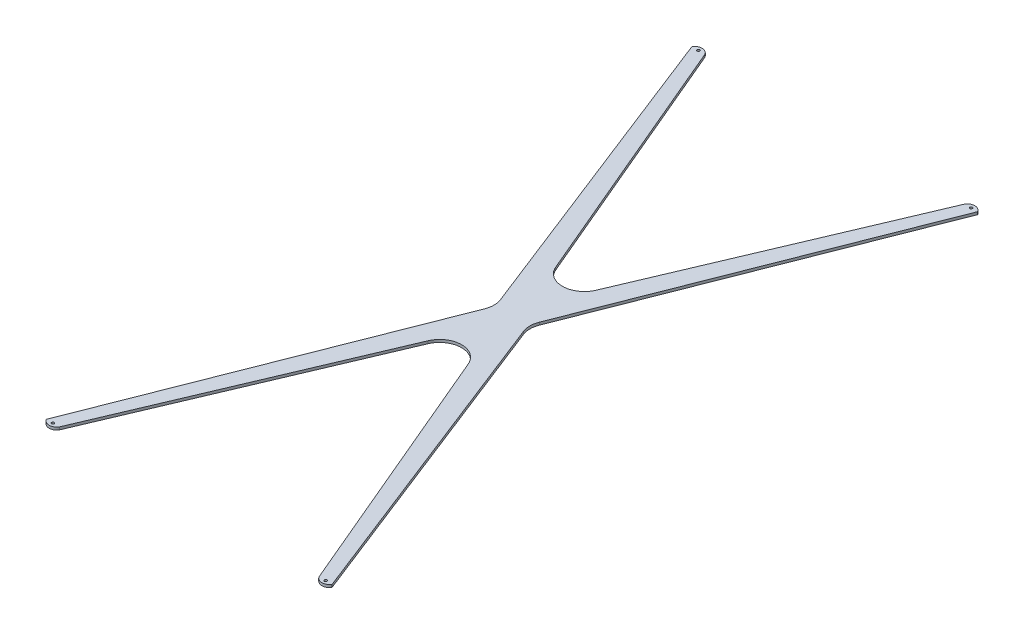
ISO-10303-21;
HEADER;
FILE_DESCRIPTION(('STEP AP214'),'2;1');
FILE_NAME('part.step','',(''),(''),'','','');
FILE_SCHEMA(('AUTOMOTIVE_DESIGN { 1 0 10303 214 1 1 1 1 }'));
ENDSEC;
DATA;
#1=APPLICATION_CONTEXT('core data for automotive mechanical design processes');
#2=APPLICATION_PROTOCOL_DEFINITION('international standard','automotive_design',2000,#1);
#3=PRODUCT_CONTEXT('',#1,'mechanical');
#4=PRODUCT('Part','Part','',(#3));
#5=PRODUCT_RELATED_PRODUCT_CATEGORY('part','',(#4));
#6=PRODUCT_DEFINITION_FORMATION('','',#4);
#7=PRODUCT_DEFINITION_CONTEXT('part definition',#1,'design');
#8=PRODUCT_DEFINITION('design','',#6,#7);
#9=PRODUCT_DEFINITION_SHAPE('','',#8);
#10=(LENGTH_UNIT() NAMED_UNIT(*) SI_UNIT(.MILLI.,.METRE.));
#11=(NAMED_UNIT(*) PLANE_ANGLE_UNIT() SI_UNIT($,.RADIAN.));
#12=(NAMED_UNIT(*) SI_UNIT($,.STERADIAN.) SOLID_ANGLE_UNIT());
#13=UNCERTAINTY_MEASURE_WITH_UNIT(LENGTH_MEASURE(1.E-05),#10,'distance_accuracy_value','');
#14=(GEOMETRIC_REPRESENTATION_CONTEXT(3) GLOBAL_UNCERTAINTY_ASSIGNED_CONTEXT((#13)) GLOBAL_UNIT_ASSIGNED_CONTEXT((#10,
#11,#12)) REPRESENTATION_CONTEXT('',''));
#15=CARTESIAN_POINT('',(0.,0.,0.));
#16=DIRECTION('',(0.,0.,1.));
#17=DIRECTION('',(1.,0.,0.));
#18=AXIS2_PLACEMENT_3D('',#15,#16,#17);
#19=CARTESIAN_POINT('',(0.,12.,-2941.02941176471));
#20=DIRECTION('',(0.,-1.,0.));
#21=DIRECTION('',(0.,0.,-1.));
#22=AXIS2_PLACEMENT_3D('',#19,#20,#21);
#23=PLANE('',#22);
#24=CARTESIAN_POINT('',(0.,12.,-2941.02941176471));
#25=DIRECTION('',(0.,1.,0.));
#26=DIRECTION('',(0.,0.,-1.));
#27=AXIS2_PLACEMENT_3D('',#24,#25,#26);
#28=CIRCLE('',#27,34.9705882352942);
#29=CARTESIAN_POINT('',(30.,12.,-2959.));
#30=VERTEX_POINT('',#29);
#31=CARTESIAN_POINT('',(-30.,12.,-2959.));
#32=VERTEX_POINT('',#31);
#33=EDGE_CURVE('E158',#30,#32,#28,.T.);
#34=ORIENTED_EDGE('',*,*,#33,.T.);
#35=DIRECTION('',(0.364980584988872,0.,0.93101513015696));
#36=VECTOR('',#35,1.);
#37=CARTESIAN_POINT('',(550.,12.,-1479.5));
#38=LINE('',#37,#36);
#39=CARTESIAN_POINT('',(535.691872977794,12.,-1515.99805849889));
#40=VERTEX_POINT('',#39);
#41=EDGE_CURVE('E146',#32,#40,#38,.T.);
#42=ORIENTED_EDGE('',*,*,#41,.T.);
#43=CARTESIAN_POINT('',(442.590359962098,12.,-1479.5));
#44=DIRECTION('',(0.,-1.,0.));
#45=DIRECTION('',(0.,0.,-1.));
#46=AXIS2_PLACEMENT_3D('',#43,#44,#45);
#47=CIRCLE('',#46,100.);
#48=CARTESIAN_POINT('',(535.691872977794,12.,-1443.00194150111));
#49=VERTEX_POINT('',#48);
#50=EDGE_CURVE('E199',#40,#49,#47,.T.);
#51=ORIENTED_EDGE('',*,*,#50,.T.);
#52=DIRECTION('',(-0.364980584988872,0.,0.93101513015696));
#53=VECTOR('',#52,1.);
#54=CARTESIAN_POINT('',(550.,12.,-1479.5));
#55=LINE('',#54,#53);
#56=CARTESIAN_POINT('',(-30.,12.,0.));
#57=VERTEX_POINT('',#56);
#58=EDGE_CURVE('E157',#49,#57,#55,.T.);
#59=ORIENTED_EDGE('',*,*,#58,.T.);
#60=CARTESIAN_POINT('',(0.,12.,-17.9705882352943));
#61=DIRECTION('',(0.,1.,0.));
#62=DIRECTION('',(0.,0.,1.));
#63=AXIS2_PLACEMENT_3D('',#60,#61,#62);
#64=CIRCLE('',#63,34.9705882352942);
#65=CARTESIAN_POINT('',(30.,12.,0.));
#66=VERTEX_POINT('',#65);
#67=EDGE_CURVE('E292',#57,#66,#64,.T.);
#68=ORIENTED_EDGE('',*,*,#67,.T.);
#69=DIRECTION('',(0.390078380257152,0.,-0.920781655581798));
#70=VECTOR('',#69,1.);
#71=CARTESIAN_POINT('',(30.,12.,0.));
#72=LINE('',#71,#70);
#73=CARTESIAN_POINT('',(532.92183444182,12.,-1187.14910331687));
#74=VERTEX_POINT('',#73);
#75=EDGE_CURVE('E266',#66,#74,#72,.T.);
#76=ORIENTED_EDGE('',*,*,#75,.T.);
#77=CARTESIAN_POINT('',(625.,12.,-1148.14126529115));
#78=DIRECTION('',(0.,-1.,0.));
#79=DIRECTION('',(0.,0.,-1.));
#80=AXIS2_PLACEMENT_3D('',#77,#78,#79);
#81=CIRCLE('',#80,100.);
#82=CARTESIAN_POINT('',(717.07816555818,12.,-1187.14910331687));
#83=VERTEX_POINT('',#82);
#84=EDGE_CURVE('E11',#74,#83,#81,.T.);
#85=ORIENTED_EDGE('',*,*,#84,.T.);
#86=DIRECTION('',(0.390078380257152,0.,0.920781655581798));
#87=VECTOR('',#86,1.);
#88=CARTESIAN_POINT('',(625.,12.,-1404.5));
#89=LINE('',#88,#87);
#90=CARTESIAN_POINT('',(1220.,12.,0.));
#91=VERTEX_POINT('',#90);
#92=EDGE_CURVE('E289',#83,#91,#89,.T.);
#93=ORIENTED_EDGE('',*,*,#92,.T.);
#94=CARTESIAN_POINT('',(1250.,12.,-17.9705882352938));
#95=DIRECTION('',(0.,1.,0.));
#96=DIRECTION('',(0.,0.,-1.));
#97=AXIS2_PLACEMENT_3D('',#94,#95,#96);
#98=CIRCLE('',#97,34.970588235294);
#99=CARTESIAN_POINT('',(1280.,12.,-4.57966997657877E-13));
#100=VERTEX_POINT('',#99);
#101=EDGE_CURVE('E287',#91,#100,#98,.T.);
#102=ORIENTED_EDGE('',*,*,#101,.T.);
#103=DIRECTION('',(-0.364980584988872,0.,-0.93101513015696));
#104=VECTOR('',#103,1.);
#105=CARTESIAN_POINT('',(1280.,12.,0.));
#106=LINE('',#105,#104);
#107=CARTESIAN_POINT('',(714.308127022207,12.,-1443.00194150111));
#108=VERTEX_POINT('',#107);
#109=EDGE_CURVE('E214',#100,#108,#106,.T.);
#110=ORIENTED_EDGE('',*,*,#109,.T.);
#111=CARTESIAN_POINT('',(807.409640037902,12.,-1479.5));
#112=DIRECTION('',(0.,-1.,0.));
#113=DIRECTION('',(0.,0.,-1.));
#114=AXIS2_PLACEMENT_3D('',#111,#112,#113);
#115=CIRCLE('',#114,100.);
#116=CARTESIAN_POINT('',(714.308127022206,12.,-1515.99805849889));
#117=VERTEX_POINT('',#116);
#118=EDGE_CURVE('E207',#108,#117,#115,.T.);
#119=ORIENTED_EDGE('',*,*,#118,.T.);
#120=DIRECTION('',(0.364980584988872,0.,-0.93101513015696));
#121=VECTOR('',#120,1.);
#122=CARTESIAN_POINT('',(700.,12.,-1479.5));
#123=LINE('',#122,#121);
#124=CARTESIAN_POINT('',(1280.,12.,-2959.));
#125=VERTEX_POINT('',#124);
#126=EDGE_CURVE('E211',#117,#125,#123,.T.);
#127=ORIENTED_EDGE('',*,*,#126,.T.);
#128=CARTESIAN_POINT('',(1250.,12.,-2941.02941176471));
#129=DIRECTION('',(0.,1.,0.));
#130=DIRECTION('',(0.,0.,1.));
#131=AXIS2_PLACEMENT_3D('',#128,#129,#130);
#132=CIRCLE('',#131,34.9705882352942);
#133=CARTESIAN_POINT('',(1220.,12.,-2959.));
#134=VERTEX_POINT('',#133);
#135=EDGE_CURVE('E224',#125,#134,#132,.T.);
#136=ORIENTED_EDGE('',*,*,#135,.T.);
#137=DIRECTION('',(-0.390078380257152,0.,0.920781655581798));
#138=VECTOR('',#137,1.);
#139=CARTESIAN_POINT('',(625.,12.,-1554.5));
#140=LINE('',#139,#138);
#141=CARTESIAN_POINT('',(717.07816555818,12.,-1771.85089668313));
#142=VERTEX_POINT('',#141);
#143=EDGE_CURVE('E282',#134,#142,#140,.T.);
#144=ORIENTED_EDGE('',*,*,#143,.T.);
#145=CARTESIAN_POINT('',(625.,12.,-1810.85873470885));
#146=DIRECTION('',(0.,-1.,0.));
#147=DIRECTION('',(0.,0.,-1.));
#148=AXIS2_PLACEMENT_3D('',#145,#146,#147);
#149=CIRCLE('',#148,100.);
#150=CARTESIAN_POINT('',(532.92183444182,12.,-1771.85089668313));
#151=VERTEX_POINT('',#150);
#152=EDGE_CURVE('E203',#142,#151,#149,.T.);
#153=ORIENTED_EDGE('',*,*,#152,.T.);
#154=DIRECTION('',(-0.390078380257152,0.,-0.920781655581798));
#155=VECTOR('',#154,1.);
#156=CARTESIAN_POINT('',(30.,12.,-2959.));
#157=LINE('',#156,#155);
#158=EDGE_CURVE('E163',#151,#30,#157,.T.);
#159=ORIENTED_EDGE('',*,*,#158,.T.);
#160=EDGE_LOOP('',(#34,#42,#51,#59,#68,#76,#85,#93,#102,#110,#119,#127,#136,#144,#153,#159));
#161=FACE_BOUND('',#160,.T.);
#162=CARTESIAN_POINT('',(1250.,12.,-2959.));
#163=DIRECTION('',(0.,1.,0.));
#164=DIRECTION('',(0.,0.,1.));
#165=AXIS2_PLACEMENT_3D('',#162,#163,#164);
#166=CIRCLE('',#165,6.0000000000001);
#167=CARTESIAN_POINT('',(1250.,12.,-2953.));
#168=VERTEX_POINT('',#167);
#169=EDGE_CURVE('E280',#168,#168,#166,.T.);
#170=ORIENTED_EDGE('',*,*,#169,.F.);
#171=EDGE_LOOP('',(#170));
#172=FACE_BOUND('',#171,.T.);
#173=CARTESIAN_POINT('',(0.,12.,-2959.));
#174=DIRECTION('',(0.,1.,0.));
#175=DIRECTION('',(0.,0.,1.));
#176=AXIS2_PLACEMENT_3D('',#173,#174,#175);
#177=CIRCLE('',#176,6.00000000000001);
#178=CARTESIAN_POINT('',(0.,12.,-2953.));
#179=VERTEX_POINT('',#178);
#180=EDGE_CURVE('E298',#179,#179,#177,.T.);
#181=ORIENTED_EDGE('',*,*,#180,.F.);
#182=EDGE_LOOP('',(#181));
#183=FACE_BOUND('',#182,.T.);
#184=CARTESIAN_POINT('',(1250.,12.,0.));
#185=DIRECTION('',(0.,1.,0.));
#186=DIRECTION('',(0.,0.,1.));
#187=AXIS2_PLACEMENT_3D('',#184,#185,#186);
#188=CIRCLE('',#187,6.0000000000001);
#189=CARTESIAN_POINT('',(1250.,12.,6.0000000000001));
#190=VERTEX_POINT('',#189);
#191=EDGE_CURVE('E304',#190,#190,#188,.T.);
#192=ORIENTED_EDGE('',*,*,#191,.F.);
#193=EDGE_LOOP('',(#192));
#194=FACE_BOUND('',#193,.T.);
#195=CARTESIAN_POINT('',(0.,12.,0.));
#196=DIRECTION('',(0.,1.,0.));
#197=DIRECTION('',(0.,0.,1.));
#198=AXIS2_PLACEMENT_3D('',#195,#196,#197);
#199=CIRCLE('',#198,6.);
#200=CARTESIAN_POINT('',(0.,12.,6.));
#201=VERTEX_POINT('',#200);
#202=EDGE_CURVE('E310',#201,#201,#199,.T.);
#203=ORIENTED_EDGE('',*,*,#202,.F.);
#204=EDGE_LOOP('',(#203));
#205=FACE_BOUND('',#204,.T.);
#206=ADVANCED_FACE('F33',(#161,#172,#183,#194,#205),#23,.F.);
#207=CARTESIAN_POINT('',(0.,0.,-2941.02941176471));
#208=DIRECTION('',(0.,-1.,0.));
#209=DIRECTION('',(0.,0.,-1.));
#210=AXIS2_PLACEMENT_3D('',#207,#208,#209);
#211=PLANE('',#210);
#212=CARTESIAN_POINT('',(1250.,0.,0.));
#213=DIRECTION('',(0.,1.,0.));
#214=DIRECTION('',(0.,0.,1.));
#215=AXIS2_PLACEMENT_3D('',#212,#213,#214);
#216=CIRCLE('',#215,6.0000000000001);
#217=CARTESIAN_POINT('',(1250.,0.,6.0000000000001));
#218=VERTEX_POINT('',#217);
#219=EDGE_CURVE('E307',#218,#218,#216,.T.);
#220=ORIENTED_EDGE('',*,*,#219,.T.);
#221=EDGE_LOOP('',(#220));
#222=FACE_BOUND('',#221,.T.);
#223=CARTESIAN_POINT('',(1250.,0.,-2959.));
#224=DIRECTION('',(0.,1.,0.));
#225=DIRECTION('',(0.,0.,1.));
#226=AXIS2_PLACEMENT_3D('',#223,#224,#225);
#227=CIRCLE('',#226,6.0000000000001);
#228=CARTESIAN_POINT('',(1250.,0.,-2953.));
#229=VERTEX_POINT('',#228);
#230=EDGE_CURVE('E295',#229,#229,#227,.T.);
#231=ORIENTED_EDGE('',*,*,#230,.T.);
#232=EDGE_LOOP('',(#231));
#233=FACE_BOUND('',#232,.T.);
#234=CARTESIAN_POINT('',(0.,0.,-2941.02941176471));
#235=DIRECTION('',(0.,1.,0.));
#236=DIRECTION('',(0.,0.,-1.));
#237=AXIS2_PLACEMENT_3D('',#234,#235,#236);
#238=CIRCLE('',#237,34.9705882352942);
#239=CARTESIAN_POINT('',(30.,0.,-2959.));
#240=VERTEX_POINT('',#239);
#241=CARTESIAN_POINT('',(-30.,0.,-2959.));
#242=VERTEX_POINT('',#241);
#243=EDGE_CURVE('E171',#240,#242,#238,.T.);
#244=ORIENTED_EDGE('',*,*,#243,.F.);
#245=DIRECTION('',(-0.390078380257152,0.,-0.920781655581798));
#246=VECTOR('',#245,1.);
#247=CARTESIAN_POINT('',(30.,0.,-2959.));
#248=LINE('',#247,#246);
#249=CARTESIAN_POINT('',(532.92183444182,0.,-1771.85089668313));
#250=VERTEX_POINT('',#249);
#251=EDGE_CURVE('E167',#250,#240,#248,.T.);
#252=ORIENTED_EDGE('',*,*,#251,.F.);
#253=CARTESIAN_POINT('',(625.,0.,-1810.85873470885));
#254=DIRECTION('',(0.,-1.,0.));
#255=DIRECTION('',(0.,0.,-1.));
#256=AXIS2_PLACEMENT_3D('',#253,#254,#255);
#257=CIRCLE('',#256,100.);
#258=CARTESIAN_POINT('',(717.07816555818,0.,-1771.85089668313));
#259=VERTEX_POINT('',#258);
#260=EDGE_CURVE('E201',#250,#259,#257,.F.);
#261=ORIENTED_EDGE('',*,*,#260,.T.);
#262=DIRECTION('',(-0.390078380257152,0.,0.920781655581798));
#263=VECTOR('',#262,1.);
#264=CARTESIAN_POINT('',(625.,0.,-1554.5));
#265=LINE('',#264,#263);
#266=CARTESIAN_POINT('',(1220.,0.,-2959.));
#267=VERTEX_POINT('',#266);
#268=EDGE_CURVE('E249',#267,#259,#265,.T.);
#269=ORIENTED_EDGE('',*,*,#268,.F.);
#270=CARTESIAN_POINT('',(1250.,0.,-2941.02941176471));
#271=DIRECTION('',(0.,1.,0.));
#272=DIRECTION('',(0.,0.,1.));
#273=AXIS2_PLACEMENT_3D('',#270,#271,#272);
#274=CIRCLE('',#273,34.9705882352942);
#275=CARTESIAN_POINT('',(1280.,0.,-2959.));
#276=VERTEX_POINT('',#275);
#277=EDGE_CURVE('E242',#276,#267,#274,.T.);
#278=ORIENTED_EDGE('',*,*,#277,.F.);
#279=DIRECTION('',(0.364980584988872,0.,-0.93101513015696));
#280=VECTOR('',#279,1.);
#281=CARTESIAN_POINT('',(700.,0.,-1479.5));
#282=LINE('',#281,#280);
#283=CARTESIAN_POINT('',(714.308127022206,0.,-1515.99805849889));
#284=VERTEX_POINT('',#283);
#285=EDGE_CURVE('E234',#284,#276,#282,.T.);
#286=ORIENTED_EDGE('',*,*,#285,.F.);
#287=CARTESIAN_POINT('',(807.409640037902,0.,-1479.5));
#288=DIRECTION('',(0.,-1.,0.));
#289=DIRECTION('',(0.,0.,-1.));
#290=AXIS2_PLACEMENT_3D('',#287,#288,#289);
#291=CIRCLE('',#290,100.);
#292=CARTESIAN_POINT('',(714.308127022207,0.,-1443.00194150111));
#293=VERTEX_POINT('',#292);
#294=EDGE_CURVE('E205',#284,#293,#291,.F.);
#295=ORIENTED_EDGE('',*,*,#294,.T.);
#296=DIRECTION('',(-0.364980584988872,0.,-0.93101513015696));
#297=VECTOR('',#296,1.);
#298=CARTESIAN_POINT('',(1280.,0.,0.));
#299=LINE('',#298,#297);
#300=CARTESIAN_POINT('',(1280.,0.,-4.57966997657877E-13));
#301=VERTEX_POINT('',#300);
#302=EDGE_CURVE('E232',#301,#293,#299,.T.);
#303=ORIENTED_EDGE('',*,*,#302,.F.);
#304=CARTESIAN_POINT('',(1250.,0.,-17.9705882352938));
#305=DIRECTION('',(0.,1.,0.));
#306=DIRECTION('',(0.,0.,-1.));
#307=AXIS2_PLACEMENT_3D('',#304,#305,#306);
#308=CIRCLE('',#307,34.970588235294);
#309=CARTESIAN_POINT('',(1220.,0.,0.));
#310=VERTEX_POINT('',#309);
#311=EDGE_CURVE('E240',#310,#301,#308,.T.);
#312=ORIENTED_EDGE('',*,*,#311,.F.);
#313=DIRECTION('',(0.390078380257152,0.,0.920781655581798));
#314=VECTOR('',#313,1.);
#315=CARTESIAN_POINT('',(625.,0.,-1404.5));
#316=LINE('',#315,#314);
#317=CARTESIAN_POINT('',(717.07816555818,0.,-1187.14910331687));
#318=VERTEX_POINT('',#317);
#319=EDGE_CURVE('E244',#318,#310,#316,.T.);
#320=ORIENTED_EDGE('',*,*,#319,.F.);
#321=CARTESIAN_POINT('',(625.,0.,-1148.14126529115));
#322=DIRECTION('',(0.,-1.,0.));
#323=DIRECTION('',(0.,0.,-1.));
#324=AXIS2_PLACEMENT_3D('',#321,#322,#323);
#325=CIRCLE('',#324,100.);
#326=CARTESIAN_POINT('',(532.92183444182,0.,-1187.14910331687));
#327=VERTEX_POINT('',#326);
#328=EDGE_CURVE('E41',#318,#327,#325,.F.);
#329=ORIENTED_EDGE('',*,*,#328,.T.);
#330=DIRECTION('',(0.390078380257152,0.,-0.920781655581798));
#331=VECTOR('',#330,1.);
#332=CARTESIAN_POINT('',(30.,0.,0.));
#333=LINE('',#332,#331);
#334=CARTESIAN_POINT('',(30.,0.,0.));
#335=VERTEX_POINT('',#334);
#336=EDGE_CURVE('E265',#335,#327,#333,.T.);
#337=ORIENTED_EDGE('',*,*,#336,.F.);
#338=CARTESIAN_POINT('',(0.,0.,-17.9705882352943));
#339=DIRECTION('',(0.,1.,0.));
#340=DIRECTION('',(0.,0.,1.));
#341=AXIS2_PLACEMENT_3D('',#338,#339,#340);
#342=CIRCLE('',#341,34.9705882352942);
#343=CARTESIAN_POINT('',(-30.,0.,0.));
#344=VERTEX_POINT('',#343);
#345=EDGE_CURVE('E271',#344,#335,#342,.T.);
#346=ORIENTED_EDGE('',*,*,#345,.F.);
#347=DIRECTION('',(-0.364980584988872,0.,0.93101513015696));
#348=VECTOR('',#347,1.);
#349=CARTESIAN_POINT('',(550.,0.,-1479.5));
#350=LINE('',#349,#348);
#351=CARTESIAN_POINT('',(535.691872977794,0.,-1443.00194150111));
#352=VERTEX_POINT('',#351);
#353=EDGE_CURVE('E273',#352,#344,#350,.T.);
#354=ORIENTED_EDGE('',*,*,#353,.F.);
#355=CARTESIAN_POINT('',(442.590359962098,0.,-1479.5));
#356=DIRECTION('',(0.,-1.,0.));
#357=DIRECTION('',(0.,0.,-1.));
#358=AXIS2_PLACEMENT_3D('',#355,#356,#357);
#359=CIRCLE('',#358,100.);
#360=CARTESIAN_POINT('',(535.691872977794,0.,-1515.99805849889));
#361=VERTEX_POINT('',#360);
#362=EDGE_CURVE('E197',#352,#361,#359,.F.);
#363=ORIENTED_EDGE('',*,*,#362,.T.);
#364=DIRECTION('',(0.364980584988872,0.,0.93101513015696));
#365=VECTOR('',#364,1.);
#366=CARTESIAN_POINT('',(550.,0.,-1479.5));
#367=LINE('',#366,#365);
#368=EDGE_CURVE('E277',#242,#361,#367,.T.);
#369=ORIENTED_EDGE('',*,*,#368,.F.);
#370=EDGE_LOOP('',(#244,#252,#261,#269,#278,#286,#295,#303,#312,#320,#329,#337,#346,#354,#363,#369));
#371=FACE_BOUND('',#370,.T.);
#372=CARTESIAN_POINT('',(0.,0.,-2959.));
#373=DIRECTION('',(0.,1.,0.));
#374=DIRECTION('',(0.,0.,1.));
#375=AXIS2_PLACEMENT_3D('',#372,#373,#374);
#376=CIRCLE('',#375,6.00000000000001);
#377=CARTESIAN_POINT('',(0.,0.,-2953.));
#378=VERTEX_POINT('',#377);
#379=EDGE_CURVE('E301',#378,#378,#376,.T.);
#380=ORIENTED_EDGE('',*,*,#379,.T.);
#381=EDGE_LOOP('',(#380));
#382=FACE_BOUND('',#381,.T.);
#383=CARTESIAN_POINT('',(0.,0.,0.));
#384=DIRECTION('',(0.,1.,0.));
#385=DIRECTION('',(0.,0.,1.));
#386=AXIS2_PLACEMENT_3D('',#383,#384,#385);
#387=CIRCLE('',#386,6.);
#388=CARTESIAN_POINT('',(0.,0.,6.));
#389=VERTEX_POINT('',#388);
#390=EDGE_CURVE('E313',#389,#389,#387,.T.);
#391=ORIENTED_EDGE('',*,*,#390,.T.);
#392=EDGE_LOOP('',(#391));
#393=FACE_BOUND('',#392,.T.);
#394=ADVANCED_FACE('F229',(#222,#233,#371,#382,#393),#211,.T.);
#395=CARTESIAN_POINT('',(0.,12.,-2941.02941176471));
#396=DIRECTION('',(0.,-1.,0.));
#397=DIRECTION('',(0.,0.,-1.));
#398=AXIS2_PLACEMENT_3D('',#395,#396,#397);
#399=CYLINDRICAL_SURFACE('',#398,34.9705882352942);
#400=ORIENTED_EDGE('',*,*,#243,.T.);
#401=DIRECTION('',(0.,-1.,0.));
#402=VECTOR('',#401,1.);
#403=CARTESIAN_POINT('',(-30.,12.,-2959.));
#404=LINE('',#403,#402);
#405=EDGE_CURVE('E151',#32,#242,#404,.T.);
#406=ORIENTED_EDGE('',*,*,#405,.F.);
#407=ORIENTED_EDGE('',*,*,#33,.F.);
#408=DIRECTION('',(0.,-1.,0.));
#409=VECTOR('',#408,1.);
#410=CARTESIAN_POINT('',(30.,12.,-2959.));
#411=LINE('',#410,#409);
#412=EDGE_CURVE('E253',#30,#240,#411,.T.);
#413=ORIENTED_EDGE('',*,*,#412,.T.);
#414=EDGE_LOOP('',(#400,#406,#407,#413));
#415=FACE_BOUND('',#414,.T.);
#416=ADVANCED_FACE('F169',(#415),#399,.T.);
#417=CARTESIAN_POINT('',(550.,12.,-1479.5));
#418=DIRECTION('',(0.93101513015696,0.,-0.364980584988872));
#419=DIRECTION('',(-0.364980584988872,0.,-0.93101513015696));
#420=AXIS2_PLACEMENT_3D('',#417,#418,#419);
#421=PLANE('',#420);
#422=ORIENTED_EDGE('',*,*,#368,.T.);
#423=DIRECTION('',(0.,-1.,0.));
#424=VECTOR('',#423,1.);
#425=CARTESIAN_POINT('',(535.691872977794,12.,-1515.99805849889));
#426=LINE('',#425,#424);
#427=EDGE_CURVE('E154',#361,#40,#426,.F.);
#428=ORIENTED_EDGE('',*,*,#427,.T.);
#429=ORIENTED_EDGE('',*,*,#41,.F.);
#430=ORIENTED_EDGE('',*,*,#405,.T.);
#431=EDGE_LOOP('',(#422,#428,#429,#430));
#432=FACE_BOUND('',#431,.T.);
#433=ADVANCED_FACE('F149',(#432),#421,.F.);
#434=CARTESIAN_POINT('',(550.,12.,-1479.5));
#435=DIRECTION('',(0.93101513015696,0.,0.364980584988872));
#436=DIRECTION('',(0.364980584988872,0.,-0.93101513015696));
#437=AXIS2_PLACEMENT_3D('',#434,#435,#436);
#438=PLANE('',#437);
#439=ORIENTED_EDGE('',*,*,#58,.F.);
#440=DIRECTION('',(0.,-1.,0.));
#441=VECTOR('',#440,1.);
#442=CARTESIAN_POINT('',(535.691872977794,0.,-1443.00194150111));
#443=LINE('',#442,#441);
#444=EDGE_CURVE('E172',#49,#352,#443,.T.);
#445=ORIENTED_EDGE('',*,*,#444,.T.);
#446=ORIENTED_EDGE('',*,*,#353,.T.);
#447=DIRECTION('',(0.,-1.,0.));
#448=VECTOR('',#447,1.);
#449=CARTESIAN_POINT('',(-30.,12.,0.));
#450=LINE('',#449,#448);
#451=EDGE_CURVE('E173',#57,#344,#450,.T.);
#452=ORIENTED_EDGE('',*,*,#451,.F.);
#453=EDGE_LOOP('',(#439,#445,#446,#452));
#454=FACE_BOUND('',#453,.T.);
#455=ADVANCED_FACE('F362',(#454),#438,.F.);
#456=CARTESIAN_POINT('',(0.,12.,-17.9705882352943));
#457=DIRECTION('',(0.,-1.,0.));
#458=DIRECTION('',(0.,0.,-1.));
#459=AXIS2_PLACEMENT_3D('',#456,#457,#458);
#460=CYLINDRICAL_SURFACE('',#459,34.9705882352942);
#461=ORIENTED_EDGE('',*,*,#345,.T.);
#462=DIRECTION('',(0.,-1.,0.));
#463=VECTOR('',#462,1.);
#464=CARTESIAN_POINT('',(30.,12.,0.));
#465=LINE('',#464,#463);
#466=EDGE_CURVE('E178',#66,#335,#465,.T.);
#467=ORIENTED_EDGE('',*,*,#466,.F.);
#468=ORIENTED_EDGE('',*,*,#67,.F.);
#469=ORIENTED_EDGE('',*,*,#451,.T.);
#470=EDGE_LOOP('',(#461,#467,#468,#469));
#471=FACE_BOUND('',#470,.T.);
#472=ADVANCED_FACE('F359',(#471),#460,.T.);
#473=CARTESIAN_POINT('',(30.,12.,0.));
#474=DIRECTION('',(-0.920781655581798,0.,-0.390078380257152));
#475=DIRECTION('',(-0.390078380257152,0.,0.920781655581798));
#476=AXIS2_PLACEMENT_3D('',#473,#474,#475);
#477=PLANE('',#476);
#478=ORIENTED_EDGE('',*,*,#336,.T.);
#479=DIRECTION('',(0.,-1.,0.));
#480=VECTOR('',#479,1.);
#481=CARTESIAN_POINT('',(532.92183444182,12.,-1187.14910331687));
#482=LINE('',#481,#480);
#483=EDGE_CURVE('E48',#327,#74,#482,.F.);
#484=ORIENTED_EDGE('',*,*,#483,.T.);
#485=ORIENTED_EDGE('',*,*,#75,.F.);
#486=ORIENTED_EDGE('',*,*,#466,.T.);
#487=EDGE_LOOP('',(#478,#484,#485,#486));
#488=FACE_BOUND('',#487,.T.);
#489=ADVANCED_FACE('F264',(#488),#477,.F.);
#490=CARTESIAN_POINT('',(625.,12.,-1404.5));
#491=DIRECTION('',(0.920781655581798,0.,-0.390078380257152));
#492=DIRECTION('',(-0.390078380257152,0.,-0.920781655581798));
#493=AXIS2_PLACEMENT_3D('',#490,#491,#492);
#494=PLANE('',#493);
#495=ORIENTED_EDGE('',*,*,#92,.F.);
#496=DIRECTION('',(0.,-1.,0.));
#497=VECTOR('',#496,1.);
#498=CARTESIAN_POINT('',(717.07816555818,0.,-1187.14910331687));
#499=LINE('',#498,#497);
#500=EDGE_CURVE('E193',#83,#318,#499,.T.);
#501=ORIENTED_EDGE('',*,*,#500,.T.);
#502=ORIENTED_EDGE('',*,*,#319,.T.);
#503=DIRECTION('',(0.,-1.,0.));
#504=VECTOR('',#503,1.);
#505=CARTESIAN_POINT('',(1220.,12.,0.));
#506=LINE('',#505,#504);
#507=EDGE_CURVE('E260',#91,#310,#506,.T.);
#508=ORIENTED_EDGE('',*,*,#507,.F.);
#509=EDGE_LOOP('',(#495,#501,#502,#508));
#510=FACE_BOUND('',#509,.T.);
#511=ADVANCED_FACE('F352',(#510),#494,.F.);
#512=CARTESIAN_POINT('',(1250.,12.,-17.9705882352938));
#513=DIRECTION('',(0.,-1.,0.));
#514=DIRECTION('',(0.,0.,-1.));
#515=AXIS2_PLACEMENT_3D('',#512,#513,#514);
#516=CYLINDRICAL_SURFACE('',#515,34.970588235294);
#517=ORIENTED_EDGE('',*,*,#311,.T.);
#518=DIRECTION('',(0.,-1.,0.));
#519=VECTOR('',#518,1.);
#520=CARTESIAN_POINT('',(1280.,12.,-4.57966997657877E-13));
#521=LINE('',#520,#519);
#522=EDGE_CURVE('E239',#100,#301,#521,.T.);
#523=ORIENTED_EDGE('',*,*,#522,.F.);
#524=ORIENTED_EDGE('',*,*,#101,.F.);
#525=ORIENTED_EDGE('',*,*,#507,.T.);
#526=EDGE_LOOP('',(#517,#523,#524,#525));
#527=FACE_BOUND('',#526,.T.);
#528=ADVANCED_FACE('F349',(#527),#516,.T.);
#529=CARTESIAN_POINT('',(1280.,12.,0.));
#530=DIRECTION('',(-0.93101513015696,0.,0.364980584988872));
#531=DIRECTION('',(0.364980584988872,0.,0.93101513015696));
#532=AXIS2_PLACEMENT_3D('',#529,#530,#531);
#533=PLANE('',#532);
#534=ORIENTED_EDGE('',*,*,#302,.T.);
#535=DIRECTION('',(0.,-1.,0.));
#536=VECTOR('',#535,1.);
#537=CARTESIAN_POINT('',(714.308127022207,12.,-1443.00194150111));
#538=LINE('',#537,#536);
#539=EDGE_CURVE('E191',#293,#108,#538,.F.);
#540=ORIENTED_EDGE('',*,*,#539,.T.);
#541=ORIENTED_EDGE('',*,*,#109,.F.);
#542=ORIENTED_EDGE('',*,*,#522,.T.);
#543=EDGE_LOOP('',(#534,#540,#541,#542));
#544=FACE_BOUND('',#543,.T.);
#545=ADVANCED_FACE('F237',(#544),#533,.F.);
#546=CARTESIAN_POINT('',(700.,12.,-1479.5));
#547=DIRECTION('',(-0.93101513015696,0.,-0.364980584988872));
#548=DIRECTION('',(-0.364980584988872,0.,0.93101513015696));
#549=AXIS2_PLACEMENT_3D('',#546,#547,#548);
#550=PLANE('',#549);
#551=ORIENTED_EDGE('',*,*,#126,.F.);
#552=DIRECTION('',(0.,-1.,0.));
#553=VECTOR('',#552,1.);
#554=CARTESIAN_POINT('',(714.308127022206,0.,-1515.99805849889));
#555=LINE('',#554,#553);
#556=EDGE_CURVE('E188',#117,#284,#555,.T.);
#557=ORIENTED_EDGE('',*,*,#556,.T.);
#558=ORIENTED_EDGE('',*,*,#285,.T.);
#559=DIRECTION('',(0.,-1.,0.));
#560=VECTOR('',#559,1.);
#561=CARTESIAN_POINT('',(1280.,12.,-2959.));
#562=LINE('',#561,#560);
#563=EDGE_CURVE('E222',#125,#276,#562,.T.);
#564=ORIENTED_EDGE('',*,*,#563,.F.);
#565=EDGE_LOOP('',(#551,#557,#558,#564));
#566=FACE_BOUND('',#565,.T.);
#567=ADVANCED_FACE('F219',(#566),#550,.F.);
#568=CARTESIAN_POINT('',(1250.,12.,-2941.02941176471));
#569=DIRECTION('',(0.,-1.,0.));
#570=DIRECTION('',(0.,0.,-1.));
#571=AXIS2_PLACEMENT_3D('',#568,#569,#570);
#572=CYLINDRICAL_SURFACE('',#571,34.9705882352942);
#573=ORIENTED_EDGE('',*,*,#277,.T.);
#574=DIRECTION('',(0.,-1.,0.));
#575=VECTOR('',#574,1.);
#576=CARTESIAN_POINT('',(1220.,12.,-2959.));
#577=LINE('',#576,#575);
#578=EDGE_CURVE('E255',#134,#267,#577,.T.);
#579=ORIENTED_EDGE('',*,*,#578,.F.);
#580=ORIENTED_EDGE('',*,*,#135,.F.);
#581=ORIENTED_EDGE('',*,*,#563,.T.);
#582=EDGE_LOOP('',(#573,#579,#580,#581));
#583=FACE_BOUND('',#582,.T.);
#584=ADVANCED_FACE('F340',(#583),#572,.T.);
#585=CARTESIAN_POINT('',(625.,12.,-1554.5));
#586=DIRECTION('',(0.920781655581798,0.,0.390078380257152));
#587=DIRECTION('',(0.390078380257152,0.,-0.920781655581798));
#588=AXIS2_PLACEMENT_3D('',#585,#586,#587);
#589=PLANE('',#588);
#590=ORIENTED_EDGE('',*,*,#268,.T.);
#591=DIRECTION('',(0.,-1.,0.));
#592=VECTOR('',#591,1.);
#593=CARTESIAN_POINT('',(717.07816555818,12.,-1771.85089668313));
#594=LINE('',#593,#592);
#595=EDGE_CURVE('E186',#259,#142,#594,.F.);
#596=ORIENTED_EDGE('',*,*,#595,.T.);
#597=ORIENTED_EDGE('',*,*,#143,.F.);
#598=ORIENTED_EDGE('',*,*,#578,.T.);
#599=EDGE_LOOP('',(#590,#596,#597,#598));
#600=FACE_BOUND('',#599,.T.);
#601=ADVANCED_FACE('F336',(#600),#589,.F.);
#602=CARTESIAN_POINT('',(30.,12.,-2959.));
#603=DIRECTION('',(-0.920781655581798,0.,0.390078380257152));
#604=DIRECTION('',(0.390078380257152,0.,0.920781655581798));
#605=AXIS2_PLACEMENT_3D('',#602,#603,#604);
#606=PLANE('',#605);
#607=ORIENTED_EDGE('',*,*,#158,.F.);
#608=DIRECTION('',(0.,-1.,0.));
#609=VECTOR('',#608,1.);
#610=CARTESIAN_POINT('',(532.92183444182,0.,-1771.85089668313));
#611=LINE('',#610,#609);
#612=EDGE_CURVE('E183',#151,#250,#611,.T.);
#613=ORIENTED_EDGE('',*,*,#612,.T.);
#614=ORIENTED_EDGE('',*,*,#251,.T.);
#615=ORIENTED_EDGE('',*,*,#412,.F.);
#616=EDGE_LOOP('',(#607,#613,#614,#615));
#617=FACE_BOUND('',#616,.T.);
#618=ADVANCED_FACE('F333',(#617),#606,.F.);
#619=CARTESIAN_POINT('',(1250.,12.,-2959.));
#620=DIRECTION('',(0.,-1.,0.));
#621=DIRECTION('',(0.,0.,-1.));
#622=AXIS2_PLACEMENT_3D('',#619,#620,#621);
#623=CYLINDRICAL_SURFACE('',#622,6.0000000000001);
#624=ORIENTED_EDGE('',*,*,#169,.T.);
#625=EDGE_LOOP('',(#624));
#626=FACE_BOUND('',#625,.T.);
#627=ORIENTED_EDGE('',*,*,#230,.F.);
#628=EDGE_LOOP('',(#627));
#629=FACE_BOUND('',#628,.T.);
#630=ADVANCED_FACE('F330',(#626,#629),#623,.F.);
#631=CARTESIAN_POINT('',(0.,12.,-2959.));
#632=DIRECTION('',(0.,-1.,0.));
#633=DIRECTION('',(0.,0.,-1.));
#634=AXIS2_PLACEMENT_3D('',#631,#632,#633);
#635=CYLINDRICAL_SURFACE('',#634,6.00000000000001);
#636=ORIENTED_EDGE('',*,*,#180,.T.);
#637=EDGE_LOOP('',(#636));
#638=FACE_BOUND('',#637,.T.);
#639=ORIENTED_EDGE('',*,*,#379,.F.);
#640=EDGE_LOOP('',(#639));
#641=FACE_BOUND('',#640,.T.);
#642=ADVANCED_FACE('F497',(#638,#641),#635,.F.);
#643=CARTESIAN_POINT('',(1250.,12.,0.));
#644=DIRECTION('',(0.,-1.,0.));
#645=DIRECTION('',(0.,0.,-1.));
#646=AXIS2_PLACEMENT_3D('',#643,#644,#645);
#647=CYLINDRICAL_SURFACE('',#646,6.0000000000001);
#648=ORIENTED_EDGE('',*,*,#191,.T.);
#649=EDGE_LOOP('',(#648));
#650=FACE_BOUND('',#649,.T.);
#651=ORIENTED_EDGE('',*,*,#219,.F.);
#652=EDGE_LOOP('',(#651));
#653=FACE_BOUND('',#652,.T.);
#654=ADVANCED_FACE('F488',(#650,#653),#647,.F.);
#655=CARTESIAN_POINT('',(0.,12.,0.));
#656=DIRECTION('',(0.,-1.,0.));
#657=DIRECTION('',(0.,0.,-1.));
#658=AXIS2_PLACEMENT_3D('',#655,#656,#657);
#659=CYLINDRICAL_SURFACE('',#658,6.);
#660=ORIENTED_EDGE('',*,*,#202,.T.);
#661=EDGE_LOOP('',(#660));
#662=FACE_BOUND('',#661,.T.);
#663=ORIENTED_EDGE('',*,*,#390,.F.);
#664=EDGE_LOOP('',(#663));
#665=FACE_BOUND('',#664,.T.);
#666=ADVANCED_FACE('F319',(#662,#665),#659,.F.);
#667=CARTESIAN_POINT('',(442.590359962098,12.,-1479.5));
#668=DIRECTION('',(0.,1.,0.));
#669=DIRECTION('',(0.,0.,1.));
#670=AXIS2_PLACEMENT_3D('',#667,#668,#669);
#671=CYLINDRICAL_SURFACE('',#670,100.);
#672=ORIENTED_EDGE('',*,*,#50,.F.);
#673=ORIENTED_EDGE('',*,*,#427,.F.);
#674=ORIENTED_EDGE('',*,*,#362,.F.);
#675=ORIENTED_EDGE('',*,*,#444,.F.);
#676=EDGE_LOOP('',(#672,#673,#674,#675));
#677=FACE_BOUND('',#676,.T.);
#678=ADVANCED_FACE('F370',(#677),#671,.F.);
#679=CARTESIAN_POINT('',(625.,12.,-1810.85873470885));
#680=DIRECTION('',(0.,1.,0.));
#681=DIRECTION('',(0.,0.,1.));
#682=AXIS2_PLACEMENT_3D('',#679,#680,#681);
#683=CYLINDRICAL_SURFACE('',#682,100.);
#684=ORIENTED_EDGE('',*,*,#152,.F.);
#685=ORIENTED_EDGE('',*,*,#595,.F.);
#686=ORIENTED_EDGE('',*,*,#260,.F.);
#687=ORIENTED_EDGE('',*,*,#612,.F.);
#688=EDGE_LOOP('',(#684,#685,#686,#687));
#689=FACE_BOUND('',#688,.T.);
#690=ADVANCED_FACE('F373',(#689),#683,.F.);
#691=CARTESIAN_POINT('',(807.409640037902,12.,-1479.5));
#692=DIRECTION('',(0.,1.,0.));
#693=DIRECTION('',(0.,0.,1.));
#694=AXIS2_PLACEMENT_3D('',#691,#692,#693);
#695=CYLINDRICAL_SURFACE('',#694,100.);
#696=ORIENTED_EDGE('',*,*,#118,.F.);
#697=ORIENTED_EDGE('',*,*,#539,.F.);
#698=ORIENTED_EDGE('',*,*,#294,.F.);
#699=ORIENTED_EDGE('',*,*,#556,.F.);
#700=EDGE_LOOP('',(#696,#697,#698,#699));
#701=FACE_BOUND('',#700,.T.);
#702=ADVANCED_FACE('F226',(#701),#695,.F.);
#703=CARTESIAN_POINT('',(625.,12.,-1148.14126529115));
#704=DIRECTION('',(0.,1.,0.));
#705=DIRECTION('',(0.,0.,1.));
#706=AXIS2_PLACEMENT_3D('',#703,#704,#705);
#707=CYLINDRICAL_SURFACE('',#706,100.);
#708=ORIENTED_EDGE('',*,*,#84,.F.);
#709=ORIENTED_EDGE('',*,*,#483,.F.);
#710=ORIENTED_EDGE('',*,*,#328,.F.);
#711=ORIENTED_EDGE('',*,*,#500,.F.);
#712=EDGE_LOOP('',(#708,#709,#710,#711));
#713=FACE_BOUND('',#712,.T.);
#714=ADVANCED_FACE('F35',(#713),#707,.F.);
#715=CLOSED_SHELL('',(#206,#394,#416,#433,#455,#472,#489,#511,#528,#545,#567,#584,#601,#618,
#630,#642,#654,#666,#678,#690,#702,#714));
#716=MANIFOLD_SOLID_BREP('B2',#715);
#717=ADVANCED_BREP_SHAPE_REPRESENTATION('',(#18,#716),#14);
#718=SHAPE_DEFINITION_REPRESENTATION(#9,#717);
ENDSEC;
END-ISO-10303-21;
